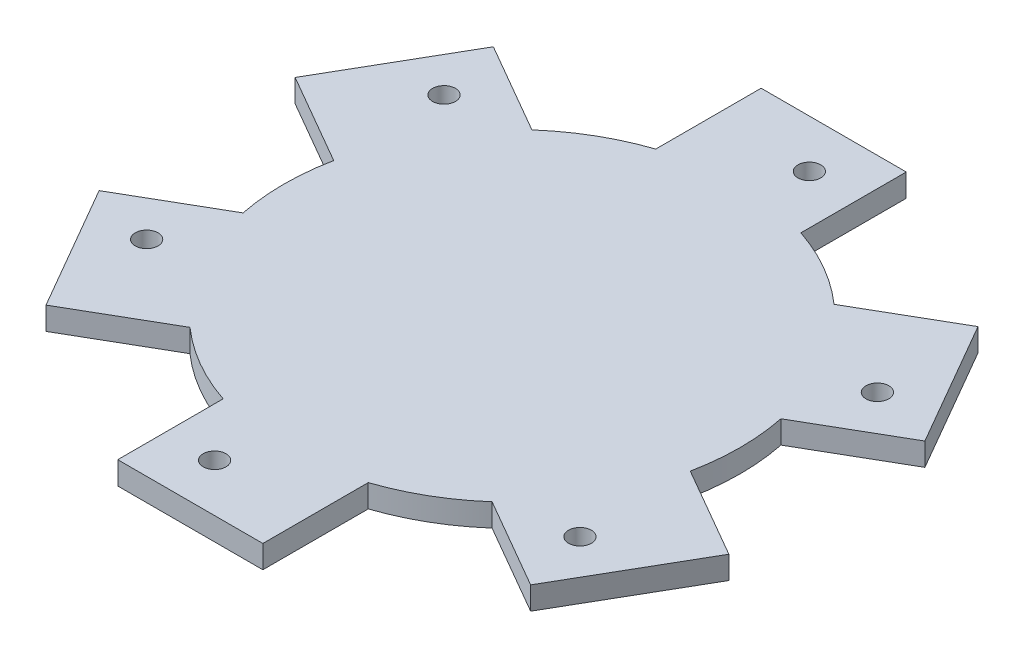
ISO-10303-21;
HEADER;
FILE_DESCRIPTION(('STEP AP214'),'2;1');
FILE_NAME('part.step','',(''),(''),'','','');
FILE_SCHEMA(('AUTOMOTIVE_DESIGN { 1 0 10303 214 1 1 1 1 }'));
ENDSEC;
DATA;
#1=APPLICATION_CONTEXT('core data for automotive mechanical design processes');
#2=APPLICATION_PROTOCOL_DEFINITION('international standard','automotive_design',2000,#1);
#3=PRODUCT_CONTEXT('',#1,'mechanical');
#4=PRODUCT('Part','Part','',(#3));
#5=PRODUCT_RELATED_PRODUCT_CATEGORY('part','',(#4));
#6=PRODUCT_DEFINITION_FORMATION('','',#4);
#7=PRODUCT_DEFINITION_CONTEXT('part definition',#1,'design');
#8=PRODUCT_DEFINITION('design','',#6,#7);
#9=PRODUCT_DEFINITION_SHAPE('','',#8);
#10=(LENGTH_UNIT() NAMED_UNIT(*) SI_UNIT(.MILLI.,.METRE.));
#11=(NAMED_UNIT(*) PLANE_ANGLE_UNIT() SI_UNIT($,.RADIAN.));
#12=(NAMED_UNIT(*) SI_UNIT($,.STERADIAN.) SOLID_ANGLE_UNIT());
#13=UNCERTAINTY_MEASURE_WITH_UNIT(LENGTH_MEASURE(1.E-05),#10,'distance_accuracy_value','');
#14=(GEOMETRIC_REPRESENTATION_CONTEXT(3) GLOBAL_UNCERTAINTY_ASSIGNED_CONTEXT((#13)) GLOBAL_UNIT_ASSIGNED_CONTEXT((#10,
#11,#12)) REPRESENTATION_CONTEXT('',''));
#15=CARTESIAN_POINT('',(0.,0.,0.));
#16=DIRECTION('',(0.,0.,1.));
#17=DIRECTION('',(1.,0.,0.));
#18=AXIS2_PLACEMENT_3D('',#15,#16,#17);
#19=CARTESIAN_POINT('',(0.,5.,0.));
#20=DIRECTION('',(0.,-1.,0.));
#21=DIRECTION('',(0.,0.,-1.));
#22=AXIS2_PLACEMENT_3D('',#19,#20,#21);
#23=CYLINDRICAL_SURFACE('',#22,50.);
#24=DIRECTION('',(0.,-1.,0.));
#25=VECTOR('',#24,1.);
#26=CARTESIAN_POINT('',(-33.1035321257502,5.,-37.4720717441593));
#27=LINE('',#26,#25);
#28=CARTESIAN_POINT('',(-33.1035321257502,5.,-37.4720717441593));
#29=VERTEX_POINT('',#28);
#30=CARTESIAN_POINT('',(-33.1035321257502,0.,-37.4720717441593));
#31=VERTEX_POINT('',#30);
#32=EDGE_CURVE('E294',#29,#31,#27,.T.);
#33=ORIENTED_EDGE('',*,*,#32,.F.);
#34=CARTESIAN_POINT('',(0.,5.,0.));
#35=DIRECTION('',(0.,1.,0.));
#36=DIRECTION('',(0.,0.,1.));
#37=AXIS2_PLACEMENT_3D('',#34,#35,#36);
#38=CIRCLE('',#37,50.);
#39=CARTESIAN_POINT('',(-15.9,5.,-47.4045356479736));
#40=VERTEX_POINT('',#39);
#41=EDGE_CURVE('E307',#40,#29,#38,.T.);
#42=ORIENTED_EDGE('',*,*,#41,.F.);
#43=DIRECTION('',(0.,-1.,0.));
#44=VECTOR('',#43,1.);
#45=CARTESIAN_POINT('',(-15.9,5.,-47.4045356479736));
#46=LINE('',#45,#44);
#47=CARTESIAN_POINT('',(-15.9,0.,-47.4045356479736));
#48=VERTEX_POINT('',#47);
#49=EDGE_CURVE('E331',#40,#48,#46,.T.);
#50=ORIENTED_EDGE('',*,*,#49,.T.);
#51=CARTESIAN_POINT('',(0.,0.,0.));
#52=DIRECTION('',(0.,1.,0.));
#53=DIRECTION('',(0.,0.,1.));
#54=AXIS2_PLACEMENT_3D('',#51,#52,#53);
#55=CIRCLE('',#54,50.);
#56=EDGE_CURVE('E332',#48,#31,#55,.T.);
#57=ORIENTED_EDGE('',*,*,#56,.T.);
#58=EDGE_LOOP('',(#33,#42,#50,#57));
#59=FACE_BOUND('',#58,.T.);
#60=ADVANCED_FACE('F35',(#59),#23,.T.);
#61=CARTESIAN_POINT('',(-49.0035321257502,5.,-9.93246390381413));
#62=VERTEX_POINT('',#61);
#63=CARTESIAN_POINT('',(-49.0035321257501,5.,9.93246390381444));
#64=VERTEX_POINT('',#63);
#65=EDGE_CURVE('E311',#62,#64,#38,.T.);
#66=ORIENTED_EDGE('',*,*,#65,.F.);
#67=DIRECTION('',(0.,-1.,0.));
#68=VECTOR('',#67,1.);
#69=CARTESIAN_POINT('',(-49.0035321257502,5.,-9.93246390381413));
#70=LINE('',#69,#68);
#71=CARTESIAN_POINT('',(-49.0035321257502,0.,-9.93246390381413));
#72=VERTEX_POINT('',#71);
#73=EDGE_CURVE('E271',#62,#72,#70,.T.);
#74=ORIENTED_EDGE('',*,*,#73,.T.);
#75=CARTESIAN_POINT('',(-49.0035321257501,0.,9.93246390381444));
#76=VERTEX_POINT('',#75);
#77=EDGE_CURVE('E335',#72,#76,#55,.T.);
#78=ORIENTED_EDGE('',*,*,#77,.T.);
#79=DIRECTION('',(0.,-1.,0.));
#80=VECTOR('',#79,1.);
#81=CARTESIAN_POINT('',(-49.0035321257501,5.,9.93246390381445));
#82=LINE('',#81,#80);
#83=EDGE_CURVE('E247',#64,#76,#82,.T.);
#84=ORIENTED_EDGE('',*,*,#83,.F.);
#85=EDGE_LOOP('',(#66,#74,#78,#84));
#86=FACE_BOUND('',#85,.T.);
#87=ADVANCED_FACE('F436',(#86),#23,.T.);
#88=CARTESIAN_POINT('',(0.,5.,0.));
#89=DIRECTION('',(0.,-1.,0.));
#90=DIRECTION('',(0.,0.,-1.));
#91=AXIS2_PLACEMENT_3D('',#88,#89,#90);
#92=CYLINDRICAL_SURFACE('',#91,50.);
#93=DIRECTION('',(0.,-1.,0.));
#94=VECTOR('',#93,1.);
#95=CARTESIAN_POINT('',(49.0035321257502,5.,9.9324639038141));
#96=LINE('',#95,#94);
#97=CARTESIAN_POINT('',(49.0035321257502,5.,9.9324639038141));
#98=VERTEX_POINT('',#97);
#99=CARTESIAN_POINT('',(49.0035321257502,0.,9.9324639038141));
#100=VERTEX_POINT('',#99);
#101=EDGE_CURVE('E297',#98,#100,#96,.T.);
#102=ORIENTED_EDGE('',*,*,#101,.T.);
#103=CARTESIAN_POINT('',(0.,0.,0.));
#104=DIRECTION('',(0.,1.,0.));
#105=DIRECTION('',(0.,0.,1.));
#106=AXIS2_PLACEMENT_3D('',#103,#104,#105);
#107=CIRCLE('',#106,50.);
#108=CARTESIAN_POINT('',(49.0035321257501,0.,-9.93246390381446));
#109=VERTEX_POINT('',#108);
#110=EDGE_CURVE('E347',#100,#109,#107,.T.);
#111=ORIENTED_EDGE('',*,*,#110,.T.);
#112=DIRECTION('',(0.,-1.,0.));
#113=VECTOR('',#112,1.);
#114=CARTESIAN_POINT('',(49.0035321257501,5.,-9.93246390381447));
#115=LINE('',#114,#113);
#116=CARTESIAN_POINT('',(49.0035321257501,5.,-9.93246390381446));
#117=VERTEX_POINT('',#116);
#118=EDGE_CURVE('E203',#117,#109,#115,.T.);
#119=ORIENTED_EDGE('',*,*,#118,.F.);
#120=CARTESIAN_POINT('',(0.,5.,0.));
#121=DIRECTION('',(0.,1.,0.));
#122=DIRECTION('',(0.,0.,1.));
#123=AXIS2_PLACEMENT_3D('',#120,#121,#122);
#124=CIRCLE('',#123,50.);
#125=EDGE_CURVE('E57',#98,#117,#124,.T.);
#126=ORIENTED_EDGE('',*,*,#125,.F.);
#127=EDGE_LOOP('',(#102,#111,#119,#126));
#128=FACE_BOUND('',#127,.T.);
#129=ADVANCED_FACE('F404',(#128),#92,.T.);
#130=DIRECTION('',(0.,-1.,0.));
#131=VECTOR('',#130,1.);
#132=CARTESIAN_POINT('',(33.10353212575,5.,-37.4720717441595));
#133=LINE('',#132,#131);
#134=CARTESIAN_POINT('',(33.10353212575,5.,-37.4720717441595));
#135=VERTEX_POINT('',#134);
#136=CARTESIAN_POINT('',(33.10353212575,0.,-37.4720717441595));
#137=VERTEX_POINT('',#136);
#138=EDGE_CURVE('E249',#135,#137,#133,.T.);
#139=ORIENTED_EDGE('',*,*,#138,.T.);
#140=CARTESIAN_POINT('',(15.9,0.,-47.4045356479736));
#141=VERTEX_POINT('',#140);
#142=EDGE_CURVE('E343',#137,#141,#107,.T.);
#143=ORIENTED_EDGE('',*,*,#142,.T.);
#144=DIRECTION('',(0.,-1.,0.));
#145=VECTOR('',#144,1.);
#146=CARTESIAN_POINT('',(15.9,5.,-47.4045356479736));
#147=LINE('',#146,#145);
#148=CARTESIAN_POINT('',(15.9,5.,-47.4045356479736));
#149=VERTEX_POINT('',#148);
#150=EDGE_CURVE('E361',#149,#141,#147,.T.);
#151=ORIENTED_EDGE('',*,*,#150,.F.);
#152=EDGE_CURVE('E320',#135,#149,#124,.T.);
#153=ORIENTED_EDGE('',*,*,#152,.F.);
#154=EDGE_LOOP('',(#139,#143,#151,#153));
#155=FACE_BOUND('',#154,.T.);
#156=ADVANCED_FACE('F408',(#155),#92,.T.);
#157=CARTESIAN_POINT('',(-33.10353212575,5.,37.4720717441595));
#158=VERTEX_POINT('',#157);
#159=CARTESIAN_POINT('',(-15.9,5.,47.4045356479736));
#160=VERTEX_POINT('',#159);
#161=EDGE_CURVE('E312',#158,#160,#38,.T.);
#162=ORIENTED_EDGE('',*,*,#161,.F.);
#163=DIRECTION('',(0.,-1.,0.));
#164=VECTOR('',#163,1.);
#165=CARTESIAN_POINT('',(-33.10353212575,5.,37.4720717441595));
#166=LINE('',#165,#164);
#167=CARTESIAN_POINT('',(-33.10353212575,0.,37.4720717441595));
#168=VERTEX_POINT('',#167);
#169=EDGE_CURVE('E226',#158,#168,#166,.T.);
#170=ORIENTED_EDGE('',*,*,#169,.T.);
#171=CARTESIAN_POINT('',(-15.9,0.,47.4045356479736));
#172=VERTEX_POINT('',#171);
#173=EDGE_CURVE('E306',#168,#172,#55,.T.);
#174=ORIENTED_EDGE('',*,*,#173,.T.);
#175=DIRECTION('',(0.,-1.,0.));
#176=VECTOR('',#175,1.);
#177=CARTESIAN_POINT('',(-15.9,5.,47.4045356479736));
#178=LINE('',#177,#176);
#179=EDGE_CURVE('E11',#160,#172,#178,.T.);
#180=ORIENTED_EDGE('',*,*,#179,.F.);
#181=EDGE_LOOP('',(#162,#170,#174,#180));
#182=FACE_BOUND('',#181,.T.);
#183=ADVANCED_FACE('F37',(#182),#23,.T.);
#184=CARTESIAN_POINT('',(-15.9,5.,0.));
#185=DIRECTION('',(-1.,0.,0.));
#186=DIRECTION('',(0.,0.,1.));
#187=AXIS2_PLACEMENT_3D('',#184,#185,#186);
#188=PLANE('',#187);
#189=DIRECTION('',(0.,0.,-1.));
#190=VECTOR('',#189,1.);
#191=CARTESIAN_POINT('',(-15.9,0.,0.));
#192=LINE('',#191,#190);
#193=CARTESIAN_POINT('',(-15.9,0.,70.5));
#194=VERTEX_POINT('',#193);
#195=EDGE_CURVE('E334',#194,#172,#192,.T.);
#196=ORIENTED_EDGE('',*,*,#195,.F.);
#197=DIRECTION('',(0.,-1.,0.));
#198=VECTOR('',#197,1.);
#199=CARTESIAN_POINT('',(-15.9,5.,70.5));
#200=LINE('',#199,#198);
#201=CARTESIAN_POINT('',(-15.9,5.,70.5));
#202=VERTEX_POINT('',#201);
#203=EDGE_CURVE('E43',#202,#194,#200,.T.);
#204=ORIENTED_EDGE('',*,*,#203,.F.);
#205=DIRECTION('',(0.,0.,-1.));
#206=VECTOR('',#205,1.);
#207=CARTESIAN_POINT('',(-15.9,5.,0.));
#208=LINE('',#207,#206);
#209=EDGE_CURVE('E310',#202,#160,#208,.T.);
#210=ORIENTED_EDGE('',*,*,#209,.T.);
#211=ORIENTED_EDGE('',*,*,#179,.T.);
#212=EDGE_LOOP('',(#196,#204,#210,#211));
#213=FACE_BOUND('',#212,.T.);
#214=ADVANCED_FACE('F375',(#213),#188,.T.);
#215=CARTESIAN_POINT('',(0.,5.,70.5));
#216=DIRECTION('',(0.,0.,1.));
#217=DIRECTION('',(1.,0.,0.));
#218=AXIS2_PLACEMENT_3D('',#215,#216,#217);
#219=PLANE('',#218);
#220=DIRECTION('',(-1.,0.,0.));
#221=VECTOR('',#220,1.);
#222=CARTESIAN_POINT('',(0.,0.,70.5));
#223=LINE('',#222,#221);
#224=CARTESIAN_POINT('',(15.9,0.,70.5));
#225=VERTEX_POINT('',#224);
#226=EDGE_CURVE('E338',#225,#194,#223,.T.);
#227=ORIENTED_EDGE('',*,*,#226,.F.);
#228=DIRECTION('',(0.,-1.,0.));
#229=VECTOR('',#228,1.);
#230=CARTESIAN_POINT('',(15.9,5.,70.5));
#231=LINE('',#230,#229);
#232=CARTESIAN_POINT('',(15.9,5.,70.5));
#233=VERTEX_POINT('',#232);
#234=EDGE_CURVE('E367',#233,#225,#231,.T.);
#235=ORIENTED_EDGE('',*,*,#234,.F.);
#236=DIRECTION('',(-1.,0.,0.));
#237=VECTOR('',#236,1.);
#238=CARTESIAN_POINT('',(0.,5.,70.5));
#239=LINE('',#238,#237);
#240=EDGE_CURVE('E315',#233,#202,#239,.T.);
#241=ORIENTED_EDGE('',*,*,#240,.T.);
#242=ORIENTED_EDGE('',*,*,#203,.T.);
#243=EDGE_LOOP('',(#227,#235,#241,#242));
#244=FACE_BOUND('',#243,.T.);
#245=ADVANCED_FACE('F371',(#244),#219,.T.);
#246=CARTESIAN_POINT('',(15.9,5.,0.));
#247=DIRECTION('',(-1.,0.,0.));
#248=DIRECTION('',(0.,0.,1.));
#249=AXIS2_PLACEMENT_3D('',#246,#247,#248);
#250=PLANE('',#249);
#251=DIRECTION('',(0.,0.,-1.));
#252=VECTOR('',#251,1.);
#253=CARTESIAN_POINT('',(15.9,0.,0.));
#254=LINE('',#253,#252);
#255=CARTESIAN_POINT('',(15.9,0.,47.4045356479736));
#256=VERTEX_POINT('',#255);
#257=EDGE_CURVE('E341',#225,#256,#254,.T.);
#258=ORIENTED_EDGE('',*,*,#257,.T.);
#259=DIRECTION('',(0.,-1.,0.));
#260=VECTOR('',#259,1.);
#261=CARTESIAN_POINT('',(15.9,5.,47.4045356479736));
#262=LINE('',#261,#260);
#263=CARTESIAN_POINT('',(15.9,5.,47.4045356479736));
#264=VERTEX_POINT('',#263);
#265=EDGE_CURVE('E364',#264,#256,#262,.T.);
#266=ORIENTED_EDGE('',*,*,#265,.F.);
#267=DIRECTION('',(0.,0.,-1.));
#268=VECTOR('',#267,1.);
#269=CARTESIAN_POINT('',(15.9,5.,0.));
#270=LINE('',#269,#268);
#271=EDGE_CURVE('E318',#233,#264,#270,.T.);
#272=ORIENTED_EDGE('',*,*,#271,.F.);
#273=ORIENTED_EDGE('',*,*,#234,.T.);
#274=EDGE_LOOP('',(#258,#266,#272,#273));
#275=FACE_BOUND('',#274,.T.);
#276=ADVANCED_FACE('F385',(#275),#250,.F.);
#277=CARTESIAN_POINT('',(33.1035321257503,0.,37.4720717441593));
#278=VERTEX_POINT('',#277);
#279=EDGE_CURVE('E344',#256,#278,#107,.T.);
#280=ORIENTED_EDGE('',*,*,#279,.T.);
#281=DIRECTION('',(0.,-1.,0.));
#282=VECTOR('',#281,1.);
#283=CARTESIAN_POINT('',(33.1035321257503,5.,37.4720717441593));
#284=LINE('',#283,#282);
#285=CARTESIAN_POINT('',(33.1035321257503,5.,37.4720717441593));
#286=VERTEX_POINT('',#285);
#287=EDGE_CURVE('E303',#286,#278,#284,.T.);
#288=ORIENTED_EDGE('',*,*,#287,.F.);
#289=EDGE_CURVE('E321',#264,#286,#124,.T.);
#290=ORIENTED_EDGE('',*,*,#289,.F.);
#291=ORIENTED_EDGE('',*,*,#265,.T.);
#292=EDGE_LOOP('',(#280,#288,#290,#291));
#293=FACE_BOUND('',#292,.T.);
#294=ADVANCED_FACE('F389',(#293),#92,.T.);
#295=CARTESIAN_POINT('',(15.9,5.,0.));
#296=DIRECTION('',(-1.,0.,0.));
#297=DIRECTION('',(0.,0.,1.));
#298=AXIS2_PLACEMENT_3D('',#295,#296,#297);
#299=PLANE('',#298);
#300=DIRECTION('',(0.,0.,-1.));
#301=VECTOR('',#300,1.);
#302=CARTESIAN_POINT('',(15.9,0.,0.));
#303=LINE('',#302,#301);
#304=CARTESIAN_POINT('',(15.9,0.,-70.5));
#305=VERTEX_POINT('',#304);
#306=EDGE_CURVE('E346',#141,#305,#303,.T.);
#307=ORIENTED_EDGE('',*,*,#306,.T.);
#308=DIRECTION('',(0.,-1.,0.));
#309=VECTOR('',#308,1.);
#310=CARTESIAN_POINT('',(15.9,5.,-70.5));
#311=LINE('',#310,#309);
#312=CARTESIAN_POINT('',(15.9,5.,-70.5));
#313=VERTEX_POINT('',#312);
#314=EDGE_CURVE('E358',#313,#305,#311,.T.);
#315=ORIENTED_EDGE('',*,*,#314,.F.);
#316=DIRECTION('',(0.,0.,-1.));
#317=VECTOR('',#316,1.);
#318=CARTESIAN_POINT('',(15.9,5.,0.));
#319=LINE('',#318,#317);
#320=EDGE_CURVE('E324',#149,#313,#319,.T.);
#321=ORIENTED_EDGE('',*,*,#320,.F.);
#322=ORIENTED_EDGE('',*,*,#150,.T.);
#323=EDGE_LOOP('',(#307,#315,#321,#322));
#324=FACE_BOUND('',#323,.T.);
#325=ADVANCED_FACE('F415',(#324),#299,.F.);
#326=CARTESIAN_POINT('',(0.,5.,-70.5));
#327=DIRECTION('',(0.,0.,1.));
#328=DIRECTION('',(1.,0.,0.));
#329=AXIS2_PLACEMENT_3D('',#326,#327,#328);
#330=PLANE('',#329);
#331=DIRECTION('',(-1.,0.,0.));
#332=VECTOR('',#331,1.);
#333=CARTESIAN_POINT('',(0.,0.,-70.5));
#334=LINE('',#333,#332);
#335=CARTESIAN_POINT('',(-15.9,0.,-70.5));
#336=VERTEX_POINT('',#335);
#337=EDGE_CURVE('E349',#305,#336,#334,.T.);
#338=ORIENTED_EDGE('',*,*,#337,.T.);
#339=DIRECTION('',(0.,-1.,0.));
#340=VECTOR('',#339,1.);
#341=CARTESIAN_POINT('',(-15.9,5.,-70.5));
#342=LINE('',#341,#340);
#343=CARTESIAN_POINT('',(-15.9,5.,-70.5));
#344=VERTEX_POINT('',#343);
#345=EDGE_CURVE('E356',#344,#336,#342,.T.);
#346=ORIENTED_EDGE('',*,*,#345,.F.);
#347=DIRECTION('',(-1.,0.,0.));
#348=VECTOR('',#347,1.);
#349=CARTESIAN_POINT('',(0.,5.,-70.5));
#350=LINE('',#349,#348);
#351=EDGE_CURVE('E326',#313,#344,#350,.T.);
#352=ORIENTED_EDGE('',*,*,#351,.F.);
#353=ORIENTED_EDGE('',*,*,#314,.T.);
#354=EDGE_LOOP('',(#338,#346,#352,#353));
#355=FACE_BOUND('',#354,.T.);
#356=ADVANCED_FACE('F421',(#355),#330,.F.);
#357=CARTESIAN_POINT('',(-15.9,5.,0.));
#358=DIRECTION('',(-1.,0.,0.));
#359=DIRECTION('',(0.,0.,1.));
#360=AXIS2_PLACEMENT_3D('',#357,#358,#359);
#361=PLANE('',#360);
#362=DIRECTION('',(0.,0.,-1.));
#363=VECTOR('',#362,1.);
#364=CARTESIAN_POINT('',(-15.9,0.,0.));
#365=LINE('',#364,#363);
#366=EDGE_CURVE('E352',#48,#336,#365,.T.);
#367=ORIENTED_EDGE('',*,*,#366,.F.);
#368=ORIENTED_EDGE('',*,*,#49,.F.);
#369=DIRECTION('',(0.,0.,-1.));
#370=VECTOR('',#369,1.);
#371=CARTESIAN_POINT('',(-15.9,5.,0.));
#372=LINE('',#371,#370);
#373=EDGE_CURVE('E328',#40,#344,#372,.T.);
#374=ORIENTED_EDGE('',*,*,#373,.T.);
#375=ORIENTED_EDGE('',*,*,#345,.T.);
#376=EDGE_LOOP('',(#367,#368,#374,#375));
#377=FACE_BOUND('',#376,.T.);
#378=ADVANCED_FACE('F553',(#377),#361,.T.);
#379=CARTESIAN_POINT('',(0.,5.,0.));
#380=DIRECTION('',(0.,1.,0.));
#381=DIRECTION('',(0.,0.,1.));
#382=AXIS2_PLACEMENT_3D('',#379,#380,#381);
#383=PLANE('',#382);
#384=CARTESIAN_POINT('',(54.5465242270661,5.,-25.5226486624347));
#385=DIRECTION('',(0.,1.,0.));
#386=DIRECTION('',(0.86602540378444,0.,0.499999999999998));
#387=AXIS2_PLACEMENT_3D('',#384,#385,#386);
#388=CIRCLE('',#387,2.5);
#389=CARTESIAN_POINT('',(56.7115877365272,5.,-24.2726486624347));
#390=VERTEX_POINT('',#389);
#391=EDGE_CURVE('E517',#390,#390,#388,.T.);
#392=ORIENTED_EDGE('',*,*,#391,.F.);
#393=EDGE_LOOP('',(#392));
#394=FACE_BOUND('',#393,.T.);
#395=CARTESIAN_POINT('',(5.16999999999956,5.,-60.));
#396=DIRECTION('',(0.,1.,0.));
#397=DIRECTION('',(0.866025403784436,0.,-0.500000000000004));
#398=AXIS2_PLACEMENT_3D('',#395,#396,#397);
#399=CIRCLE('',#398,2.5);
#400=CARTESIAN_POINT('',(7.33506350946065,5.,-61.25));
#401=VERTEX_POINT('',#400);
#402=EDGE_CURVE('E524',#401,#401,#399,.T.);
#403=ORIENTED_EDGE('',*,*,#402,.F.);
#404=EDGE_LOOP('',(#403));
#405=FACE_BOUND('',#404,.T.);
#406=CARTESIAN_POINT('',(-49.3765242270663,5.,-34.4773513375654));
#407=DIRECTION('',(0.,1.,0.));
#408=DIRECTION('',(0.,0.,-1.));
#409=AXIS2_PLACEMENT_3D('',#406,#407,#408);
#410=CIRCLE('',#409,2.5);
#411=CARTESIAN_POINT('',(-49.3765242270663,5.,-36.9773513375654));
#412=VERTEX_POINT('',#411);
#413=EDGE_CURVE('E532',#412,#412,#410,.T.);
#414=ORIENTED_EDGE('',*,*,#413,.F.);
#415=EDGE_LOOP('',(#414));
#416=FACE_BOUND('',#415,.T.);
#417=CARTESIAN_POINT('',(-54.5465242270659,5.,25.5226486624351));
#418=DIRECTION('',(0.,1.,0.));
#419=DIRECTION('',(-0.866025403784443,0.,-0.499999999999992));
#420=AXIS2_PLACEMENT_3D('',#417,#418,#419);
#421=CIRCLE('',#420,2.5);
#422=CARTESIAN_POINT('',(-56.711587736527,5.,24.2726486624351));
#423=VERTEX_POINT('',#422);
#424=EDGE_CURVE('E538',#423,#423,#421,.T.);
#425=ORIENTED_EDGE('',*,*,#424,.F.);
#426=EDGE_LOOP('',(#425));
#427=FACE_BOUND('',#426,.T.);
#428=CARTESIAN_POINT('',(-5.16999999999913,5.,60.));
#429=DIRECTION('',(0.,1.,0.));
#430=DIRECTION('',(-0.866025403784433,0.,0.50000000000001));
#431=AXIS2_PLACEMENT_3D('',#428,#429,#430);
#432=CIRCLE('',#431,2.5);
#433=CARTESIAN_POINT('',(-7.33506350946021,5.,61.25));
#434=VERTEX_POINT('',#433);
#435=EDGE_CURVE('E544',#434,#434,#432,.T.);
#436=ORIENTED_EDGE('',*,*,#435,.F.);
#437=EDGE_LOOP('',(#436));
#438=FACE_BOUND('',#437,.T.);
#439=CARTESIAN_POINT('',(49.3765242270663,5.,34.4773513375654));
#440=DIRECTION('',(0.,1.,0.));
#441=DIRECTION('',(0.,0.,1.));
#442=AXIS2_PLACEMENT_3D('',#439,#440,#441);
#443=CIRCLE('',#442,2.5);
#444=CARTESIAN_POINT('',(49.3765242270663,5.,36.9773513375654));
#445=VERTEX_POINT('',#444);
#446=EDGE_CURVE('E521',#445,#445,#443,.T.);
#447=ORIENTED_EDGE('',*,*,#446,.F.);
#448=EDGE_LOOP('',(#447));
#449=FACE_BOUND('',#448,.T.);
#450=ORIENTED_EDGE('',*,*,#152,.T.);
#451=ORIENTED_EDGE('',*,*,#320,.T.);
#452=ORIENTED_EDGE('',*,*,#351,.T.);
#453=ORIENTED_EDGE('',*,*,#373,.F.);
#454=ORIENTED_EDGE('',*,*,#41,.T.);
#455=DIRECTION('',(-0.86602540378444,0.,-0.499999999999998));
#456=VECTOR('',#455,1.);
#457=CARTESIAN_POINT('',(7.94999999999998,5.,-13.7698039201726));
#458=LINE('',#457,#456);
#459=CARTESIAN_POINT('',(-53.104790966803,5.,-49.0198039201725));
#460=VERTEX_POINT('',#459);
#461=EDGE_CURVE('E264',#29,#460,#458,.T.);
#462=ORIENTED_EDGE('',*,*,#461,.T.);
#463=DIRECTION('',(-0.499999999999998,0.,0.86602540378444));
#464=VECTOR('',#463,1.);
#465=CARTESIAN_POINT('',(-61.054790966803,5.,-35.2499999999998));
#466=LINE('',#465,#464);
#467=CARTESIAN_POINT('',(-69.004790966803,5.,-21.4801960798273));
#468=VERTEX_POINT('',#467);
#469=EDGE_CURVE('E266',#460,#468,#466,.T.);
#470=ORIENTED_EDGE('',*,*,#469,.T.);
#471=DIRECTION('',(-0.86602540378444,0.,-0.499999999999998));
#472=VECTOR('',#471,1.);
#473=CARTESIAN_POINT('',(-7.94999999999996,5.,13.7698039201726));
#474=LINE('',#473,#472);
#475=EDGE_CURVE('E268',#62,#468,#474,.T.);
#476=ORIENTED_EDGE('',*,*,#475,.F.);
#477=ORIENTED_EDGE('',*,*,#65,.T.);
#478=DIRECTION('',(-0.866025403784436,0.,0.500000000000004));
#479=VECTOR('',#478,1.);
#480=CARTESIAN_POINT('',(-7.95000000000007,5.,-13.7698039201726));
#481=LINE('',#480,#479);
#482=CARTESIAN_POINT('',(-69.0047909668029,5.,21.4801960798277));
#483=VERTEX_POINT('',#482);
#484=EDGE_CURVE('E216',#64,#483,#481,.T.);
#485=ORIENTED_EDGE('',*,*,#484,.T.);
#486=DIRECTION('',(0.500000000000004,0.,0.866025403784436));
#487=VECTOR('',#486,1.);
#488=CARTESIAN_POINT('',(-61.0547909668028,5.,35.2500000000003));
#489=LINE('',#488,#487);
#490=CARTESIAN_POINT('',(-53.1047909668027,5.,49.0198039201728));
#491=VERTEX_POINT('',#490);
#492=EDGE_CURVE('E221',#483,#491,#489,.T.);
#493=ORIENTED_EDGE('',*,*,#492,.T.);
#494=DIRECTION('',(-0.866025403784436,0.,0.500000000000004));
#495=VECTOR('',#494,1.);
#496=CARTESIAN_POINT('',(7.95000000000006,5.,13.7698039201725));
#497=LINE('',#496,#495);
#498=EDGE_CURVE('E223',#158,#491,#497,.T.);
#499=ORIENTED_EDGE('',*,*,#498,.F.);
#500=ORIENTED_EDGE('',*,*,#161,.T.);
#501=ORIENTED_EDGE('',*,*,#209,.F.);
#502=ORIENTED_EDGE('',*,*,#240,.F.);
#503=ORIENTED_EDGE('',*,*,#271,.T.);
#504=ORIENTED_EDGE('',*,*,#289,.T.);
#505=DIRECTION('',(-0.86602540378444,0.,-0.499999999999998));
#506=VECTOR('',#505,1.);
#507=CARTESIAN_POINT('',(-7.94999999999996,5.,13.7698039201726));
#508=LINE('',#507,#506);
#509=CARTESIAN_POINT('',(53.104790966803,5.,49.0198039201724));
#510=VERTEX_POINT('',#509);
#511=EDGE_CURVE('E255',#510,#286,#508,.T.);
#512=ORIENTED_EDGE('',*,*,#511,.F.);
#513=DIRECTION('',(-0.499999999999998,0.,0.86602540378444));
#514=VECTOR('',#513,1.);
#515=CARTESIAN_POINT('',(61.054790966803,5.,35.2499999999998));
#516=LINE('',#515,#514);
#517=CARTESIAN_POINT('',(69.004790966803,5.,21.4801960798272));
#518=VERTEX_POINT('',#517);
#519=EDGE_CURVE('E258',#518,#510,#516,.T.);
#520=ORIENTED_EDGE('',*,*,#519,.F.);
#521=DIRECTION('',(-0.86602540378444,0.,-0.499999999999998));
#522=VECTOR('',#521,1.);
#523=CARTESIAN_POINT('',(7.94999999999998,5.,-13.7698039201726));
#524=LINE('',#523,#522);
#525=EDGE_CURVE('E262',#518,#98,#524,.T.);
#526=ORIENTED_EDGE('',*,*,#525,.T.);
#527=ORIENTED_EDGE('',*,*,#125,.T.);
#528=DIRECTION('',(-0.866025403784436,0.,0.500000000000004));
#529=VECTOR('',#528,1.);
#530=CARTESIAN_POINT('',(7.95000000000006,5.,13.7698039201725));
#531=LINE('',#530,#529);
#532=CARTESIAN_POINT('',(69.0047909668028,5.,-21.4801960798277));
#533=VERTEX_POINT('',#532);
#534=EDGE_CURVE('E50',#533,#117,#531,.T.);
#535=ORIENTED_EDGE('',*,*,#534,.F.);
#536=DIRECTION('',(0.500000000000004,0.,0.866025403784436));
#537=VECTOR('',#536,1.);
#538=CARTESIAN_POINT('',(61.0547909668027,5.,-35.2500000000003));
#539=LINE('',#538,#537);
#540=CARTESIAN_POINT('',(53.1047909668027,5.,-49.0198039201728));
#541=VERTEX_POINT('',#540);
#542=EDGE_CURVE('E209',#541,#533,#539,.T.);
#543=ORIENTED_EDGE('',*,*,#542,.F.);
#544=DIRECTION('',(-0.866025403784436,0.,0.500000000000004));
#545=VECTOR('',#544,1.);
#546=CARTESIAN_POINT('',(-7.95000000000007,5.,-13.7698039201726));
#547=LINE('',#546,#545);
#548=EDGE_CURVE('E214',#541,#135,#547,.T.);
#549=ORIENTED_EDGE('',*,*,#548,.T.);
#550=EDGE_LOOP('',(#450,#451,#452,#453,#454,#462,#470,#476,#477,#485,#493,#499,#500,#501,#502,
#503,#504,#512,#520,#526,#527,#535,#543,#549));
#551=FACE_BOUND('',#550,.T.);
#552=ADVANCED_FACE('F208',(#394,#405,#416,#427,#438,#449,#551),#383,.T.);
#553=CARTESIAN_POINT('',(0.,0.,0.));
#554=DIRECTION('',(0.,1.,0.));
#555=DIRECTION('',(0.,0.,1.));
#556=AXIS2_PLACEMENT_3D('',#553,#554,#555);
#557=PLANE('',#556);
#558=CARTESIAN_POINT('',(54.5465242270661,0.,-25.5226486624347));
#559=DIRECTION('',(0.,1.,0.));
#560=DIRECTION('',(0.86602540378444,0.,0.499999999999998));
#561=AXIS2_PLACEMENT_3D('',#558,#559,#560);
#562=CIRCLE('',#561,2.5);
#563=CARTESIAN_POINT('',(56.7115877365272,0.,-24.2726486624347));
#564=VERTEX_POINT('',#563);
#565=EDGE_CURVE('E514',#564,#564,#562,.T.);
#566=ORIENTED_EDGE('',*,*,#565,.T.);
#567=EDGE_LOOP('',(#566));
#568=FACE_BOUND('',#567,.T.);
#569=CARTESIAN_POINT('',(5.16999999999956,0.,-60.));
#570=DIRECTION('',(0.,1.,0.));
#571=DIRECTION('',(0.866025403784436,0.,-0.500000000000004));
#572=AXIS2_PLACEMENT_3D('',#569,#570,#571);
#573=CIRCLE('',#572,2.5);
#574=CARTESIAN_POINT('',(7.33506350946065,0.,-61.25));
#575=VERTEX_POINT('',#574);
#576=EDGE_CURVE('E519',#575,#575,#573,.T.);
#577=ORIENTED_EDGE('',*,*,#576,.T.);
#578=EDGE_LOOP('',(#577));
#579=FACE_BOUND('',#578,.T.);
#580=CARTESIAN_POINT('',(-49.3765242270663,0.,-34.4773513375654));
#581=DIRECTION('',(0.,1.,0.));
#582=DIRECTION('',(0.,0.,-1.));
#583=AXIS2_PLACEMENT_3D('',#580,#581,#582);
#584=CIRCLE('',#583,2.5);
#585=CARTESIAN_POINT('',(-49.3765242270663,0.,-36.9773513375654));
#586=VERTEX_POINT('',#585);
#587=EDGE_CURVE('E529',#586,#586,#584,.T.);
#588=ORIENTED_EDGE('',*,*,#587,.T.);
#589=EDGE_LOOP('',(#588));
#590=FACE_BOUND('',#589,.T.);
#591=CARTESIAN_POINT('',(-54.5465242270659,0.,25.5226486624351));
#592=DIRECTION('',(0.,1.,0.));
#593=DIRECTION('',(-0.866025403784443,0.,-0.499999999999992));
#594=AXIS2_PLACEMENT_3D('',#591,#592,#593);
#595=CIRCLE('',#594,2.5);
#596=CARTESIAN_POINT('',(-56.711587736527,0.,24.2726486624351));
#597=VERTEX_POINT('',#596);
#598=EDGE_CURVE('E535',#597,#597,#595,.T.);
#599=ORIENTED_EDGE('',*,*,#598,.T.);
#600=EDGE_LOOP('',(#599));
#601=FACE_BOUND('',#600,.T.);
#602=CARTESIAN_POINT('',(-5.16999999999913,0.,60.));
#603=DIRECTION('',(0.,1.,0.));
#604=DIRECTION('',(-0.866025403784433,0.,0.50000000000001));
#605=AXIS2_PLACEMENT_3D('',#602,#603,#604);
#606=CIRCLE('',#605,2.5);
#607=CARTESIAN_POINT('',(-7.33506350946021,0.,61.25));
#608=VERTEX_POINT('',#607);
#609=EDGE_CURVE('E541',#608,#608,#606,.T.);
#610=ORIENTED_EDGE('',*,*,#609,.T.);
#611=EDGE_LOOP('',(#610));
#612=FACE_BOUND('',#611,.T.);
#613=CARTESIAN_POINT('',(49.3765242270663,0.,34.4773513375654));
#614=DIRECTION('',(0.,1.,0.));
#615=DIRECTION('',(0.,0.,1.));
#616=AXIS2_PLACEMENT_3D('',#613,#614,#615);
#617=CIRCLE('',#616,2.5);
#618=CARTESIAN_POINT('',(49.3765242270663,0.,36.9773513375654));
#619=VERTEX_POINT('',#618);
#620=EDGE_CURVE('E229',#619,#619,#617,.T.);
#621=ORIENTED_EDGE('',*,*,#620,.T.);
#622=EDGE_LOOP('',(#621));
#623=FACE_BOUND('',#622,.T.);
#624=ORIENTED_EDGE('',*,*,#56,.F.);
#625=ORIENTED_EDGE('',*,*,#366,.T.);
#626=ORIENTED_EDGE('',*,*,#337,.F.);
#627=ORIENTED_EDGE('',*,*,#306,.F.);
#628=ORIENTED_EDGE('',*,*,#142,.F.);
#629=DIRECTION('',(-0.866025403784436,0.,0.500000000000004));
#630=VECTOR('',#629,1.);
#631=CARTESIAN_POINT('',(-7.95000000000007,0.,-13.7698039201726));
#632=LINE('',#631,#630);
#633=CARTESIAN_POINT('',(53.1047909668027,0.,-49.0198039201728));
#634=VERTEX_POINT('',#633);
#635=EDGE_CURVE('E231',#634,#137,#632,.T.);
#636=ORIENTED_EDGE('',*,*,#635,.F.);
#637=DIRECTION('',(0.500000000000004,0.,0.866025403784436));
#638=VECTOR('',#637,1.);
#639=CARTESIAN_POINT('',(61.0547909668027,0.,-35.2500000000003));
#640=LINE('',#639,#638);
#641=CARTESIAN_POINT('',(69.0047909668028,0.,-21.4801960798277));
#642=VERTEX_POINT('',#641);
#643=EDGE_CURVE('E228',#634,#642,#640,.T.);
#644=ORIENTED_EDGE('',*,*,#643,.T.);
#645=DIRECTION('',(-0.866025403784436,0.,0.500000000000004));
#646=VECTOR('',#645,1.);
#647=CARTESIAN_POINT('',(7.95000000000006,0.,13.7698039201725));
#648=LINE('',#647,#646);
#649=EDGE_CURVE('E198',#642,#109,#648,.T.);
#650=ORIENTED_EDGE('',*,*,#649,.T.);
#651=ORIENTED_EDGE('',*,*,#110,.F.);
#652=DIRECTION('',(-0.86602540378444,0.,-0.499999999999998));
#653=VECTOR('',#652,1.);
#654=CARTESIAN_POINT('',(7.94999999999998,0.,-13.7698039201726));
#655=LINE('',#654,#653);
#656=CARTESIAN_POINT('',(69.004790966803,0.,21.4801960798272));
#657=VERTEX_POINT('',#656);
#658=EDGE_CURVE('E277',#657,#100,#655,.T.);
#659=ORIENTED_EDGE('',*,*,#658,.F.);
#660=DIRECTION('',(-0.499999999999998,0.,0.86602540378444));
#661=VECTOR('',#660,1.);
#662=CARTESIAN_POINT('',(61.054790966803,0.,35.2499999999998));
#663=LINE('',#662,#661);
#664=CARTESIAN_POINT('',(53.104790966803,0.,49.0198039201724));
#665=VERTEX_POINT('',#664);
#666=EDGE_CURVE('E274',#657,#665,#663,.T.);
#667=ORIENTED_EDGE('',*,*,#666,.T.);
#668=DIRECTION('',(-0.86602540378444,0.,-0.499999999999998));
#669=VECTOR('',#668,1.);
#670=CARTESIAN_POINT('',(-7.94999999999996,0.,13.7698039201726));
#671=LINE('',#670,#669);
#672=EDGE_CURVE('E254',#665,#278,#671,.T.);
#673=ORIENTED_EDGE('',*,*,#672,.T.);
#674=ORIENTED_EDGE('',*,*,#279,.F.);
#675=ORIENTED_EDGE('',*,*,#257,.F.);
#676=ORIENTED_EDGE('',*,*,#226,.T.);
#677=ORIENTED_EDGE('',*,*,#195,.T.);
#678=ORIENTED_EDGE('',*,*,#173,.F.);
#679=DIRECTION('',(-0.866025403784436,0.,0.500000000000004));
#680=VECTOR('',#679,1.);
#681=CARTESIAN_POINT('',(7.95000000000006,0.,13.7698039201725));
#682=LINE('',#681,#680);
#683=CARTESIAN_POINT('',(-53.1047909668027,0.,49.0198039201728));
#684=VERTEX_POINT('',#683);
#685=EDGE_CURVE('E210',#168,#684,#682,.T.);
#686=ORIENTED_EDGE('',*,*,#685,.T.);
#687=DIRECTION('',(0.500000000000004,0.,0.866025403784436));
#688=VECTOR('',#687,1.);
#689=CARTESIAN_POINT('',(-61.0547909668028,0.,35.2500000000003));
#690=LINE('',#689,#688);
#691=CARTESIAN_POINT('',(-69.0047909668029,0.,21.4801960798277));
#692=VERTEX_POINT('',#691);
#693=EDGE_CURVE('E235',#692,#684,#690,.T.);
#694=ORIENTED_EDGE('',*,*,#693,.F.);
#695=DIRECTION('',(-0.866025403784436,0.,0.500000000000004));
#696=VECTOR('',#695,1.);
#697=CARTESIAN_POINT('',(-7.95000000000007,0.,-13.7698039201726));
#698=LINE('',#697,#696);
#699=EDGE_CURVE('E233',#76,#692,#698,.T.);
#700=ORIENTED_EDGE('',*,*,#699,.F.);
#701=ORIENTED_EDGE('',*,*,#77,.F.);
#702=DIRECTION('',(-0.86602540378444,0.,-0.499999999999998));
#703=VECTOR('',#702,1.);
#704=CARTESIAN_POINT('',(-7.94999999999996,0.,13.7698039201726));
#705=LINE('',#704,#703);
#706=CARTESIAN_POINT('',(-69.004790966803,0.,-21.4801960798273));
#707=VERTEX_POINT('',#706);
#708=EDGE_CURVE('E259',#72,#707,#705,.T.);
#709=ORIENTED_EDGE('',*,*,#708,.T.);
#710=DIRECTION('',(-0.499999999999998,0.,0.86602540378444));
#711=VECTOR('',#710,1.);
#712=CARTESIAN_POINT('',(-61.054790966803,0.,-35.2499999999998));
#713=LINE('',#712,#711);
#714=CARTESIAN_POINT('',(-53.104790966803,0.,-49.0198039201725));
#715=VERTEX_POINT('',#714);
#716=EDGE_CURVE('E282',#715,#707,#713,.T.);
#717=ORIENTED_EDGE('',*,*,#716,.F.);
#718=DIRECTION('',(-0.86602540378444,0.,-0.499999999999998));
#719=VECTOR('',#718,1.);
#720=CARTESIAN_POINT('',(7.94999999999998,0.,-13.7698039201726));
#721=LINE('',#720,#719);
#722=EDGE_CURVE('E280',#31,#715,#721,.T.);
#723=ORIENTED_EDGE('',*,*,#722,.F.);
#724=EDGE_LOOP('',(#624,#625,#626,#627,#628,#636,#644,#650,#651,#659,#667,#673,#674,#675,#676,
#677,#678,#686,#694,#700,#701,#709,#717,#723));
#725=FACE_BOUND('',#724,.T.);
#726=ADVANCED_FACE('F381',(#568,#579,#590,#601,#612,#623,#725),#557,.F.);
#727=CARTESIAN_POINT('',(61.0547909668027,5.,-35.2500000000003));
#728=DIRECTION('',(0.866025403784436,0.,-0.500000000000004));
#729=DIRECTION('',(-0.500000000000004,0.,-0.866025403784436));
#730=AXIS2_PLACEMENT_3D('',#727,#728,#729);
#731=PLANE('',#730);
#732=ORIENTED_EDGE('',*,*,#643,.F.);
#733=DIRECTION('',(0.,-1.,0.));
#734=VECTOR('',#733,1.);
#735=CARTESIAN_POINT('',(53.1047909668027,5.,-49.0198039201728));
#736=LINE('',#735,#734);
#737=EDGE_CURVE('E204',#541,#634,#736,.T.);
#738=ORIENTED_EDGE('',*,*,#737,.F.);
#739=ORIENTED_EDGE('',*,*,#542,.T.);
#740=DIRECTION('',(0.,-1.,0.));
#741=VECTOR('',#740,1.);
#742=CARTESIAN_POINT('',(69.0047909668028,5.,-21.4801960798277));
#743=LINE('',#742,#741);
#744=EDGE_CURVE('E195',#533,#642,#743,.T.);
#745=ORIENTED_EDGE('',*,*,#744,.T.);
#746=EDGE_LOOP('',(#732,#738,#739,#745));
#747=FACE_BOUND('',#746,.T.);
#748=ADVANCED_FACE('F212',(#747),#731,.T.);
#749=CARTESIAN_POINT('',(-7.95000000000007,5.,-13.7698039201726));
#750=DIRECTION('',(0.500000000000004,0.,0.866025403784436));
#751=DIRECTION('',(0.866025403784436,0.,-0.500000000000004));
#752=AXIS2_PLACEMENT_3D('',#749,#750,#751);
#753=PLANE('',#752);
#754=ORIENTED_EDGE('',*,*,#635,.T.);
#755=ORIENTED_EDGE('',*,*,#138,.F.);
#756=ORIENTED_EDGE('',*,*,#548,.F.);
#757=ORIENTED_EDGE('',*,*,#737,.T.);
#758=EDGE_LOOP('',(#754,#755,#756,#757));
#759=FACE_BOUND('',#758,.T.);
#760=ADVANCED_FACE('F425',(#759),#753,.F.);
#761=CARTESIAN_POINT('',(7.95000000000006,5.,13.7698039201725));
#762=DIRECTION('',(0.500000000000004,0.,0.866025403784436));
#763=DIRECTION('',(0.866025403784436,0.,-0.500000000000004));
#764=AXIS2_PLACEMENT_3D('',#761,#762,#763);
#765=PLANE('',#764);
#766=ORIENTED_EDGE('',*,*,#649,.F.);
#767=ORIENTED_EDGE('',*,*,#744,.F.);
#768=ORIENTED_EDGE('',*,*,#534,.T.);
#769=ORIENTED_EDGE('',*,*,#118,.T.);
#770=EDGE_LOOP('',(#766,#767,#768,#769));
#771=FACE_BOUND('',#770,.T.);
#772=ADVANCED_FACE('F196',(#771),#765,.T.);
#773=CARTESIAN_POINT('',(61.054790966803,5.,35.2499999999998));
#774=DIRECTION('',(0.86602540378444,0.,0.499999999999998));
#775=DIRECTION('',(0.499999999999998,0.,-0.86602540378444));
#776=AXIS2_PLACEMENT_3D('',#773,#774,#775);
#777=PLANE('',#776);
#778=ORIENTED_EDGE('',*,*,#666,.F.);
#779=DIRECTION('',(0.,-1.,0.));
#780=VECTOR('',#779,1.);
#781=CARTESIAN_POINT('',(69.004790966803,5.,21.4801960798272));
#782=LINE('',#781,#780);
#783=EDGE_CURVE('E299',#518,#657,#782,.T.);
#784=ORIENTED_EDGE('',*,*,#783,.F.);
#785=ORIENTED_EDGE('',*,*,#519,.T.);
#786=DIRECTION('',(0.,-1.,0.));
#787=VECTOR('',#786,1.);
#788=CARTESIAN_POINT('',(53.104790966803,5.,49.0198039201724));
#789=LINE('',#788,#787);
#790=EDGE_CURVE('E301',#510,#665,#789,.T.);
#791=ORIENTED_EDGE('',*,*,#790,.T.);
#792=EDGE_LOOP('',(#778,#784,#785,#791));
#793=FACE_BOUND('',#792,.T.);
#794=ADVANCED_FACE('F397',(#793),#777,.T.);
#795=CARTESIAN_POINT('',(7.94999999999998,5.,-13.7698039201726));
#796=DIRECTION('',(-0.499999999999998,0.,0.86602540378444));
#797=DIRECTION('',(0.86602540378444,0.,0.499999999999998));
#798=AXIS2_PLACEMENT_3D('',#795,#796,#797);
#799=PLANE('',#798);
#800=ORIENTED_EDGE('',*,*,#658,.T.);
#801=ORIENTED_EDGE('',*,*,#101,.F.);
#802=ORIENTED_EDGE('',*,*,#525,.F.);
#803=ORIENTED_EDGE('',*,*,#783,.T.);
#804=EDGE_LOOP('',(#800,#801,#802,#803));
#805=FACE_BOUND('',#804,.T.);
#806=ADVANCED_FACE('F401',(#805),#799,.F.);
#807=CARTESIAN_POINT('',(-7.94999999999996,5.,13.7698039201726));
#808=DIRECTION('',(-0.499999999999998,0.,0.86602540378444));
#809=DIRECTION('',(0.86602540378444,0.,0.499999999999998));
#810=AXIS2_PLACEMENT_3D('',#807,#808,#809);
#811=PLANE('',#810);
#812=ORIENTED_EDGE('',*,*,#672,.F.);
#813=ORIENTED_EDGE('',*,*,#790,.F.);
#814=ORIENTED_EDGE('',*,*,#511,.T.);
#815=ORIENTED_EDGE('',*,*,#287,.T.);
#816=EDGE_LOOP('',(#812,#813,#814,#815));
#817=FACE_BOUND('',#816,.T.);
#818=ADVANCED_FACE('F394',(#817),#811,.T.);
#819=CARTESIAN_POINT('',(-61.0547909668028,5.,35.2500000000003));
#820=DIRECTION('',(0.866025403784436,0.,-0.500000000000004));
#821=DIRECTION('',(-0.500000000000004,0.,-0.866025403784436));
#822=AXIS2_PLACEMENT_3D('',#819,#820,#821);
#823=PLANE('',#822);
#824=ORIENTED_EDGE('',*,*,#693,.T.);
#825=DIRECTION('',(0.,-1.,0.));
#826=VECTOR('',#825,1.);
#827=CARTESIAN_POINT('',(-53.1047909668027,5.,49.0198039201728));
#828=LINE('',#827,#826);
#829=EDGE_CURVE('E242',#491,#684,#828,.T.);
#830=ORIENTED_EDGE('',*,*,#829,.F.);
#831=ORIENTED_EDGE('',*,*,#492,.F.);
#832=DIRECTION('',(0.,-1.,0.));
#833=VECTOR('',#832,1.);
#834=CARTESIAN_POINT('',(-69.0047909668029,5.,21.4801960798277));
#835=LINE('',#834,#833);
#836=EDGE_CURVE('E244',#483,#692,#835,.T.);
#837=ORIENTED_EDGE('',*,*,#836,.T.);
#838=EDGE_LOOP('',(#824,#830,#831,#837));
#839=FACE_BOUND('',#838,.T.);
#840=ADVANCED_FACE('F470',(#839),#823,.F.);
#841=CARTESIAN_POINT('',(7.95000000000006,5.,13.7698039201725));
#842=DIRECTION('',(0.500000000000004,0.,0.866025403784436));
#843=DIRECTION('',(0.866025403784436,0.,-0.500000000000004));
#844=AXIS2_PLACEMENT_3D('',#841,#842,#843);
#845=PLANE('',#844);
#846=ORIENTED_EDGE('',*,*,#685,.F.);
#847=ORIENTED_EDGE('',*,*,#169,.F.);
#848=ORIENTED_EDGE('',*,*,#498,.T.);
#849=ORIENTED_EDGE('',*,*,#829,.T.);
#850=EDGE_LOOP('',(#846,#847,#848,#849));
#851=FACE_BOUND('',#850,.T.);
#852=ADVANCED_FACE('F466',(#851),#845,.T.);
#853=CARTESIAN_POINT('',(-7.95000000000007,5.,-13.7698039201726));
#854=DIRECTION('',(0.500000000000004,0.,0.866025403784436));
#855=DIRECTION('',(0.866025403784436,0.,-0.500000000000004));
#856=AXIS2_PLACEMENT_3D('',#853,#854,#855);
#857=PLANE('',#856);
#858=ORIENTED_EDGE('',*,*,#699,.T.);
#859=ORIENTED_EDGE('',*,*,#836,.F.);
#860=ORIENTED_EDGE('',*,*,#484,.F.);
#861=ORIENTED_EDGE('',*,*,#83,.T.);
#862=EDGE_LOOP('',(#858,#859,#860,#861));
#863=FACE_BOUND('',#862,.T.);
#864=ADVANCED_FACE('F472',(#863),#857,.F.);
#865=CARTESIAN_POINT('',(7.94999999999998,5.,-13.7698039201726));
#866=DIRECTION('',(-0.499999999999998,0.,0.86602540378444));
#867=DIRECTION('',(0.86602540378444,0.,0.499999999999998));
#868=AXIS2_PLACEMENT_3D('',#865,#866,#867);
#869=PLANE('',#868);
#870=ORIENTED_EDGE('',*,*,#722,.T.);
#871=DIRECTION('',(0.,-1.,0.));
#872=VECTOR('',#871,1.);
#873=CARTESIAN_POINT('',(-53.104790966803,5.,-49.0198039201725));
#874=LINE('',#873,#872);
#875=EDGE_CURVE('E291',#460,#715,#874,.T.);
#876=ORIENTED_EDGE('',*,*,#875,.F.);
#877=ORIENTED_EDGE('',*,*,#461,.F.);
#878=ORIENTED_EDGE('',*,*,#32,.T.);
#879=EDGE_LOOP('',(#870,#876,#877,#878));
#880=FACE_BOUND('',#879,.T.);
#881=ADVANCED_FACE('F474',(#880),#869,.F.);
#882=CARTESIAN_POINT('',(-61.054790966803,5.,-35.2499999999998));
#883=DIRECTION('',(0.86602540378444,0.,0.499999999999998));
#884=DIRECTION('',(0.499999999999998,0.,-0.86602540378444));
#885=AXIS2_PLACEMENT_3D('',#882,#883,#884);
#886=PLANE('',#885);
#887=ORIENTED_EDGE('',*,*,#716,.T.);
#888=DIRECTION('',(0.,-1.,0.));
#889=VECTOR('',#888,1.);
#890=CARTESIAN_POINT('',(-69.004790966803,5.,-21.4801960798273));
#891=LINE('',#890,#889);
#892=EDGE_CURVE('E289',#468,#707,#891,.T.);
#893=ORIENTED_EDGE('',*,*,#892,.F.);
#894=ORIENTED_EDGE('',*,*,#469,.F.);
#895=ORIENTED_EDGE('',*,*,#875,.T.);
#896=EDGE_LOOP('',(#887,#893,#894,#895));
#897=FACE_BOUND('',#896,.T.);
#898=ADVANCED_FACE('F479',(#897),#886,.F.);
#899=CARTESIAN_POINT('',(-7.94999999999996,5.,13.7698039201726));
#900=DIRECTION('',(-0.499999999999998,0.,0.86602540378444));
#901=DIRECTION('',(0.86602540378444,0.,0.499999999999998));
#902=AXIS2_PLACEMENT_3D('',#899,#900,#901);
#903=PLANE('',#902);
#904=ORIENTED_EDGE('',*,*,#708,.F.);
#905=ORIENTED_EDGE('',*,*,#73,.F.);
#906=ORIENTED_EDGE('',*,*,#475,.T.);
#907=ORIENTED_EDGE('',*,*,#892,.T.);
#908=EDGE_LOOP('',(#904,#905,#906,#907));
#909=FACE_BOUND('',#908,.T.);
#910=ADVANCED_FACE('F459',(#909),#903,.T.);
#911=CARTESIAN_POINT('',(49.3765242270663,0.,34.4773513375654));
#912=DIRECTION('',(0.,1.,0.));
#913=DIRECTION('',(0.,0.,1.));
#914=AXIS2_PLACEMENT_3D('',#911,#912,#913);
#915=CYLINDRICAL_SURFACE('',#914,2.5);
#916=ORIENTED_EDGE('',*,*,#620,.F.);
#917=EDGE_LOOP('',(#916));
#918=FACE_BOUND('',#917,.T.);
#919=ORIENTED_EDGE('',*,*,#446,.T.);
#920=EDGE_LOOP('',(#919));
#921=FACE_BOUND('',#920,.T.);
#922=ADVANCED_FACE('F486',(#918,#921),#915,.F.);
#923=CARTESIAN_POINT('',(-5.16999999999913,0.,60.));
#924=DIRECTION('',(0.,1.,0.));
#925=DIRECTION('',(0.,0.,1.));
#926=AXIS2_PLACEMENT_3D('',#923,#924,#925);
#927=CYLINDRICAL_SURFACE('',#926,2.5);
#928=ORIENTED_EDGE('',*,*,#609,.F.);
#929=EDGE_LOOP('',(#928));
#930=FACE_BOUND('',#929,.T.);
#931=ORIENTED_EDGE('',*,*,#435,.T.);
#932=EDGE_LOOP('',(#931));
#933=FACE_BOUND('',#932,.T.);
#934=ADVANCED_FACE('F489',(#930,#933),#927,.F.);
#935=CARTESIAN_POINT('',(-54.5465242270659,0.,25.5226486624351));
#936=DIRECTION('',(0.,1.,0.));
#937=DIRECTION('',(0.,0.,1.));
#938=AXIS2_PLACEMENT_3D('',#935,#936,#937);
#939=CYLINDRICAL_SURFACE('',#938,2.5);
#940=ORIENTED_EDGE('',*,*,#598,.F.);
#941=EDGE_LOOP('',(#940));
#942=FACE_BOUND('',#941,.T.);
#943=ORIENTED_EDGE('',*,*,#424,.T.);
#944=EDGE_LOOP('',(#943));
#945=FACE_BOUND('',#944,.T.);
#946=ADVANCED_FACE('F493',(#942,#945),#939,.F.);
#947=CARTESIAN_POINT('',(-49.3765242270663,0.,-34.4773513375654));
#948=DIRECTION('',(0.,1.,0.));
#949=DIRECTION('',(0.,0.,1.));
#950=AXIS2_PLACEMENT_3D('',#947,#948,#949);
#951=CYLINDRICAL_SURFACE('',#950,2.5);
#952=ORIENTED_EDGE('',*,*,#587,.F.);
#953=EDGE_LOOP('',(#952));
#954=FACE_BOUND('',#953,.T.);
#955=ORIENTED_EDGE('',*,*,#413,.T.);
#956=EDGE_LOOP('',(#955));
#957=FACE_BOUND('',#956,.T.);
#958=ADVANCED_FACE('F497',(#954,#957),#951,.F.);
#959=CARTESIAN_POINT('',(5.16999999999956,0.,-60.));
#960=DIRECTION('',(0.,1.,0.));
#961=DIRECTION('',(0.,0.,1.));
#962=AXIS2_PLACEMENT_3D('',#959,#960,#961);
#963=CYLINDRICAL_SURFACE('',#962,2.5);
#964=ORIENTED_EDGE('',*,*,#576,.F.);
#965=EDGE_LOOP('',(#964));
#966=FACE_BOUND('',#965,.T.);
#967=ORIENTED_EDGE('',*,*,#402,.T.);
#968=EDGE_LOOP('',(#967));
#969=FACE_BOUND('',#968,.T.);
#970=ADVANCED_FACE('F501',(#966,#969),#963,.F.);
#971=CARTESIAN_POINT('',(54.5465242270661,0.,-25.5226486624347));
#972=DIRECTION('',(0.,1.,0.));
#973=DIRECTION('',(0.,0.,1.));
#974=AXIS2_PLACEMENT_3D('',#971,#972,#973);
#975=CYLINDRICAL_SURFACE('',#974,2.5);
#976=ORIENTED_EDGE('',*,*,#565,.F.);
#977=EDGE_LOOP('',(#976));
#978=FACE_BOUND('',#977,.T.);
#979=ORIENTED_EDGE('',*,*,#391,.T.);
#980=EDGE_LOOP('',(#979));
#981=FACE_BOUND('',#980,.T.);
#982=ADVANCED_FACE('F505',(#978,#981),#975,.F.);
#983=CLOSED_SHELL('',(#60,#87,#129,#156,#183,#214,#245,#276,#294,#325,#356,#378,#552,#726,#748,
#760,#772,#794,#806,#818,#840,#852,#864,#881,#898,#910,#922,#934,#946,#958,#970,#982));
#984=MANIFOLD_SOLID_BREP('B2',#983);
#985=ADVANCED_BREP_SHAPE_REPRESENTATION('',(#18,#984),#14);
#986=SHAPE_DEFINITION_REPRESENTATION(#9,#985);
ENDSEC;
END-ISO-10303-21;
